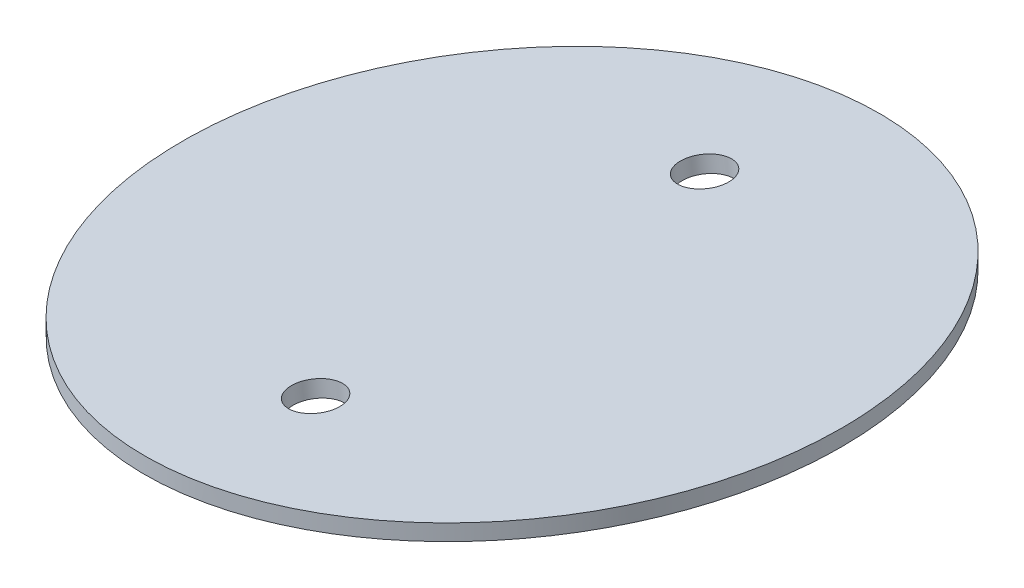
ISO-10303-21;
HEADER;
FILE_DESCRIPTION(('STEP AP214'),'2;1');
FILE_NAME('part.step','',(''),(''),'','','');
FILE_SCHEMA(('AUTOMOTIVE_DESIGN { 1 0 10303 214 1 1 1 1 }'));
ENDSEC;
DATA;
#1=APPLICATION_CONTEXT('core data for automotive mechanical design processes');
#2=APPLICATION_PROTOCOL_DEFINITION('international standard','automotive_design',2000,#1);
#3=PRODUCT_CONTEXT('',#1,'mechanical');
#4=PRODUCT('Part','Part','',(#3));
#5=PRODUCT_RELATED_PRODUCT_CATEGORY('part','',(#4));
#6=PRODUCT_DEFINITION_FORMATION('','',#4);
#7=PRODUCT_DEFINITION_CONTEXT('part definition',#1,'design');
#8=PRODUCT_DEFINITION('design','',#6,#7);
#9=PRODUCT_DEFINITION_SHAPE('','',#8);
#10=(LENGTH_UNIT() NAMED_UNIT(*) SI_UNIT(.MILLI.,.METRE.));
#11=(NAMED_UNIT(*) PLANE_ANGLE_UNIT() SI_UNIT($,.RADIAN.));
#12=(NAMED_UNIT(*) SI_UNIT($,.STERADIAN.) SOLID_ANGLE_UNIT());
#13=UNCERTAINTY_MEASURE_WITH_UNIT(LENGTH_MEASURE(1.E-05),#10,'distance_accuracy_value','');
#14=(GEOMETRIC_REPRESENTATION_CONTEXT(3) GLOBAL_UNCERTAINTY_ASSIGNED_CONTEXT((#13)) GLOBAL_UNIT_ASSIGNED_CONTEXT((#10,
#11,#12)) REPRESENTATION_CONTEXT('',''));
#15=CARTESIAN_POINT('',(0.,0.,0.));
#16=DIRECTION('',(0.,0.,1.));
#17=DIRECTION('',(1.,0.,0.));
#18=AXIS2_PLACEMENT_3D('',#15,#16,#17);
#19=CARTESIAN_POINT('',(30.5,5.24492910753862,61.));
#20=DIRECTION('',(0.121869343405148,-0.992546151641322,0.));
#21=DIRECTION('',(0.992546151641322,0.121869343405148,0.));
#22=AXIS2_PLACEMENT_3D('',#19,#20,#21);
#23=PLANE('',#22);
#24=CARTESIAN_POINT('',(-0.181441421699763,1.477721794707,48.5));
#25=DIRECTION('',(0.121869343405148,-0.992546151641322,0.));
#26=DIRECTION('',(0.992546151641322,0.121869343405148,0.));
#27=AXIS2_PLACEMENT_3D('',#24,#25,#26);
#28=CIRCLE('',#27,2.25);
#29=CARTESIAN_POINT('',(-2.41467026289274,1.20351577204542,48.5));
#30=VERTEX_POINT('',#29);
#31=EDGE_CURVE('E171',#30,#30,#28,.T.);
#32=ORIENTED_EDGE('',*,*,#31,.T.);
#33=EDGE_LOOP('',(#32));
#34=FACE_BOUND('',#33,.T.);
#35=CARTESIAN_POINT('',(-0.181441421699763,1.477721794707,12.5));
#36=DIRECTION('',(0.121869343405148,-0.992546151641322,0.));
#37=DIRECTION('',(0.992546151641322,0.121869343405148,0.));
#38=AXIS2_PLACEMENT_3D('',#35,#36,#37);
#39=CIRCLE('',#38,2.25);
#40=CARTESIAN_POINT('',(-2.41467026289274,1.20351577204542,12.5));
#41=VERTEX_POINT('',#40);
#42=EDGE_CURVE('E166',#41,#41,#39,.T.);
#43=ORIENTED_EDGE('',*,*,#42,.T.);
#44=EDGE_LOOP('',(#43));
#45=FACE_BOUND('',#44,.T.);
#46=CARTESIAN_POINT('',(0.,1.5,30.5));
#47=DIRECTION('',(0.121869343405148,-0.992546151641322,0.));
#48=DIRECTION('',(0.992546151641322,0.121869343405148,0.));
#49=AXIS2_PLACEMENT_3D('',#46,#47,#48);
#50=ELLIPSE('',#49,30.7290496764949,30.5);
#51=CARTESIAN_POINT('',(30.5,5.24492910753862,30.5));
#52=VERTEX_POINT('',#51);
#53=EDGE_CURVE('E13',#52,#52,#50,.T.);
#54=ORIENTED_EDGE('',*,*,#53,.F.);
#55=EDGE_LOOP('',(#54));
#56=FACE_BOUND('',#55,.T.);
#57=ADVANCED_FACE('F154',(#34,#45,#56),#23,.F.);
#58=CARTESIAN_POINT('',(-30.5,-3.74492910753861,61.));
#59=DIRECTION('',(-0.121869343405148,0.992546151641322,0.));
#60=DIRECTION('',(-0.992546151641322,-0.121869343405148,0.));
#61=AXIS2_PLACEMENT_3D('',#58,#59,#60);
#62=PLANE('',#61);
#63=CARTESIAN_POINT('',(0.,0.,48.5));
#64=DIRECTION('',(-0.121869343405148,0.992546151641322,0.));
#65=DIRECTION('',(-0.992546151641322,-0.121869343405148,0.));
#66=AXIS2_PLACEMENT_3D('',#63,#64,#65);
#67=CIRCLE('',#66,2.25);
#68=CARTESIAN_POINT('',(-2.23322884119299,-0.274206022661579,48.5));
#69=VERTEX_POINT('',#68);
#70=EDGE_CURVE('E157',#69,#69,#67,.T.);
#71=ORIENTED_EDGE('',*,*,#70,.T.);
#72=EDGE_LOOP('',(#71));
#73=FACE_BOUND('',#72,.T.);
#74=CARTESIAN_POINT('',(0.,0.,12.5));
#75=DIRECTION('',(-0.121869343405148,0.992546151641322,0.));
#76=DIRECTION('',(-0.992546151641322,-0.121869343405148,0.));
#77=AXIS2_PLACEMENT_3D('',#74,#75,#76);
#78=CIRCLE('',#77,2.25);
#79=CARTESIAN_POINT('',(-2.23322884119299,-0.274206022661579,12.5));
#80=VERTEX_POINT('',#79);
#81=EDGE_CURVE('E169',#80,#80,#78,.T.);
#82=ORIENTED_EDGE('',*,*,#81,.T.);
#83=EDGE_LOOP('',(#82));
#84=FACE_BOUND('',#83,.T.);
#85=CARTESIAN_POINT('',(0.,0.,30.5));
#86=DIRECTION('',(-0.121869343405148,0.992546151641322,0.));
#87=DIRECTION('',(0.992546151641322,0.121869343405148,0.));
#88=AXIS2_PLACEMENT_3D('',#85,#86,#87);
#89=ELLIPSE('',#88,30.7290496764949,30.5);
#90=CARTESIAN_POINT('',(30.5,3.74492910753863,30.5));
#91=VERTEX_POINT('',#90);
#92=EDGE_CURVE('E161',#91,#91,#89,.T.);
#93=ORIENTED_EDGE('',*,*,#92,.F.);
#94=EDGE_LOOP('',(#93));
#95=FACE_BOUND('',#94,.T.);
#96=ADVANCED_FACE('F182',(#73,#84,#95),#62,.F.);
#97=CARTESIAN_POINT('',(0.,-3.74492910753861,30.5));
#98=DIRECTION('',(0.,1.,0.));
#99=DIRECTION('',(0.,0.,1.));
#100=AXIS2_PLACEMENT_3D('',#97,#98,#99);
#101=CYLINDRICAL_SURFACE('',#100,30.5);
#102=ORIENTED_EDGE('',*,*,#53,.T.);
#103=EDGE_LOOP('',(#102));
#104=FACE_BOUND('',#103,.T.);
#105=ORIENTED_EDGE('',*,*,#92,.T.);
#106=EDGE_LOOP('',(#105));
#107=FACE_BOUND('',#106,.T.);
#108=ADVANCED_FACE('F192',(#104,#107),#101,.T.);
#109=CARTESIAN_POINT('',(0.905980348582108,-7.37861781578991,12.5));
#110=DIRECTION('',(-0.121869343405148,0.992546151641322,0.));
#111=DIRECTION('',(-0.992546151641322,-0.121869343405148,0.));
#112=AXIS2_PLACEMENT_3D('',#109,#110,#111);
#113=CYLINDRICAL_SURFACE('',#112,2.25);
#114=CARTESIAN_POINT('',(-2.23322884119299,-0.274206022661579,12.5));
#115=CARTESIAN_POINT('',(-2.23511885600236,-0.258813087300048,12.5));
#116=CARTESIAN_POINT('',(-2.23700887081173,-0.243420151938516,12.5));
#117=CARTESIAN_POINT('',(-2.24078890043048,-0.212634281215454,12.5));
#118=CARTESIAN_POINT('',(-2.24267891523985,-0.197241345853923,12.5));
#119=CARTESIAN_POINT('',(-2.24645894485859,-0.166455475130861,12.5));
#120=CARTESIAN_POINT('',(-2.24834895966796,-0.151062539769329,12.5));
#121=CARTESIAN_POINT('',(-2.25212898928671,-0.120276669046267,12.5));
#122=CARTESIAN_POINT('',(-2.25401900409608,-0.104883733684736,12.5));
#123=CARTESIAN_POINT('',(-2.25779903371483,-0.0740978629616733,12.5));
#124=CARTESIAN_POINT('',(-2.2596890485242,-0.0587049276001419,12.5));
#125=CARTESIAN_POINT('',(-2.26346907814294,-0.0279190568770795,12.5));
#126=CARTESIAN_POINT('',(-2.26535909295232,-0.0125261215155485,12.5));
#127=CARTESIAN_POINT('',(-2.26913912257106,0.0182597492075139,12.5));
#128=CARTESIAN_POINT('',(-2.27102913738043,0.0336526845690453,12.5));
#129=CARTESIAN_POINT('',(-2.27480916699918,0.0644385552921077,12.5));
#130=CARTESIAN_POINT('',(-2.27669918180855,0.0798314906536388,12.5));
#131=CARTESIAN_POINT('',(-2.2804792114273,0.110617361376701,12.5));
#132=CARTESIAN_POINT('',(-2.28236922623667,0.126010296738233,12.5));
#133=CARTESIAN_POINT('',(-2.28614925585541,0.156796167461296,12.5));
#134=CARTESIAN_POINT('',(-2.28803927066479,0.172189102822827,12.5));
#135=CARTESIAN_POINT('',(-2.29181930028353,0.20297497354589,12.5));
#136=CARTESIAN_POINT('',(-2.2937093150929,0.21836790890742,12.5));
#137=CARTESIAN_POINT('',(-2.29748934471165,0.249153779630483,12.5));
#138=CARTESIAN_POINT('',(-2.29937935952102,0.264546714992014,12.5));
#139=CARTESIAN_POINT('',(-2.30315938913977,0.295332585715077,12.5));
#140=CARTESIAN_POINT('',(-2.30504940394914,0.310725521076608,12.5));
#141=CARTESIAN_POINT('',(-2.30882943356788,0.341511391799671,12.5));
#142=CARTESIAN_POINT('',(-2.31071944837725,0.356904327161202,12.5));
#143=CARTESIAN_POINT('',(-2.314499477996,0.387690197884264,12.5));
#144=CARTESIAN_POINT('',(-2.31638949280537,0.403083133245795,12.5));
#145=CARTESIAN_POINT('',(-2.32016952242412,0.433869003968858,12.5));
#146=CARTESIAN_POINT('',(-2.32205953723349,0.449261939330389,12.5));
#147=CARTESIAN_POINT('',(-2.32583956685223,0.480047810053452,12.5));
#148=CARTESIAN_POINT('',(-2.32772958166161,0.495440745414983,12.5));
#149=CARTESIAN_POINT('',(-2.33150961128035,0.526226616138045,12.5));
#150=CARTESIAN_POINT('',(-2.33339962608972,0.541619551499577,12.5));
#151=CARTESIAN_POINT('',(-2.33717965570847,0.572405422222639,12.5));
#152=CARTESIAN_POINT('',(-2.33906967051784,0.587798357584169,12.5));
#153=CARTESIAN_POINT('',(-2.34284970013659,0.618584228307232,12.5));
#154=CARTESIAN_POINT('',(-2.34473971494596,0.633977163668764,12.5));
#155=CARTESIAN_POINT('',(-2.3485197445647,0.664763034391827,12.5));
#156=CARTESIAN_POINT('',(-2.35040975937408,0.680155969753357,12.5));
#157=CARTESIAN_POINT('',(-2.35418978899282,0.71094184047642,12.5));
#158=CARTESIAN_POINT('',(-2.35607980380219,0.726334775837951,12.5));
#159=CARTESIAN_POINT('',(-2.35985983342094,0.757120646561013,12.5));
#160=CARTESIAN_POINT('',(-2.36174984823031,0.772513581922544,12.5));
#161=CARTESIAN_POINT('',(-2.36552987784905,0.803299452645607,12.5));
#162=CARTESIAN_POINT('',(-2.36741989265843,0.818692388007139,12.5));
#163=CARTESIAN_POINT('',(-2.37119992227717,0.849478258730201,12.5));
#164=CARTESIAN_POINT('',(-2.37308993708654,0.864871194091732,12.5));
#165=CARTESIAN_POINT('',(-2.37686996670529,0.895657064814794,12.5));
#166=CARTESIAN_POINT('',(-2.37875998151466,0.911050000176325,12.5));
#167=CARTESIAN_POINT('',(-2.38254001113341,0.941835870899388,12.5));
#168=CARTESIAN_POINT('',(-2.38443002594278,0.95722880626092,12.5));
#169=CARTESIAN_POINT('',(-2.38821005556152,0.988014676983982,12.5));
#170=CARTESIAN_POINT('',(-2.3901000703709,1.00340761234551,12.5));
#171=CARTESIAN_POINT('',(-2.39388009998964,1.03419348306858,12.5));
#172=CARTESIAN_POINT('',(-2.39577011479901,1.04958641843011,12.5));
#173=CARTESIAN_POINT('',(-2.39955014441776,1.08037228915317,12.5));
#174=CARTESIAN_POINT('',(-2.40144015922713,1.0957652245147,12.5));
#175=CARTESIAN_POINT('',(-2.40522018884588,1.12655109523776,12.5));
#176=CARTESIAN_POINT('',(-2.40711020365525,1.14194403059929,12.5));
#177=CARTESIAN_POINT('',(-2.41089023327399,1.17272990132236,12.5));
#178=CARTESIAN_POINT('',(-2.41278024808336,1.18812283668389,12.5));
#179=CARTESIAN_POINT('',(-2.41467026289274,1.20351577204542,12.5));
#180=B_SPLINE_CURVE_WITH_KNOTS('',3,(#114,#115,#116,#117,#118,#119,#120,#121,#122,#123,#124,
#125,#126,#127,#128,#129,#130,#131,#132,#133,#134,#135,#136,#137,#138,#139,#140,#141,#142,#143,
#144,#145,#146,#147,#148,#149,#150,#151,#152,#153,#154,#155,#156,#157,#158,#159,#160,#161,#162,
#163,#164,#165,#166,#167,#168,#169,#170,#171,#172,#173,#174,#175,#176,#177,#178,#179),
.UNSPECIFIED.,.F.,.F.,(4,2,2,2,2,2,2,2,2,2,2,2,2,2,2,2,2,2,2,2,2,2,2,2,2,2,2,2,2,2,2,2,4),(0.,
0.0465256008581874,0.0930512017163739,0.139576802574561,0.186102403432748,0.232628004290935,
0.279153605149122,0.325679206007309,0.372204806865495,0.418730407723684,0.465256008581871,
0.511781609440057,0.558307210298244,0.604832811156431,0.651358412014619,0.697884012872804,
0.744409613730994,0.790935214589179,0.837460815447367,0.883986416305552,0.930512017163741,
0.977037618021927,1.02356321888011,1.0700888197383,1.11661442059649,1.16314002145467,
1.20966562231286,1.25619122317105,1.30271682402924,1.34924242488742,1.39576802574561,
1.4422936266038,1.48881922746198),.UNSPECIFIED.);
#181=EDGE_CURVE('BSEAM187',#80,#41,#180,.T.);
#182=ORIENTED_EDGE('',*,*,#81,.F.);
#183=ORIENTED_EDGE('',*,*,#42,.F.);
#184=ORIENTED_EDGE('',*,*,#181,.T.);
#185=ORIENTED_EDGE('',*,*,#181,.F.);
#186=EDGE_LOOP('',(#182,#184,#183,#185));
#187=FACE_BOUND('',#186,.T.);
#188=ADVANCED_FACE('F187',(#187),#113,.F.);
#189=CARTESIAN_POINT('',(0.905980348582108,-7.37861781578991,48.5));
#190=DIRECTION('',(-0.121869343405148,0.992546151641322,0.));
#191=DIRECTION('',(-0.992546151641322,-0.121869343405148,0.));
#192=AXIS2_PLACEMENT_3D('',#189,#190,#191);
#193=CYLINDRICAL_SURFACE('',#192,2.25);
#194=CARTESIAN_POINT('',(-2.23322884119299,-0.274206022661579,48.5));
#195=CARTESIAN_POINT('',(-2.23511885600236,-0.258813087300048,48.5));
#196=CARTESIAN_POINT('',(-2.23700887081173,-0.243420151938516,48.5));
#197=CARTESIAN_POINT('',(-2.24078890043048,-0.212634281215454,48.5));
#198=CARTESIAN_POINT('',(-2.24267891523985,-0.197241345853923,48.5));
#199=CARTESIAN_POINT('',(-2.24645894485859,-0.166455475130861,48.5));
#200=CARTESIAN_POINT('',(-2.24834895966797,-0.151062539769329,48.5));
#201=CARTESIAN_POINT('',(-2.25212898928671,-0.120276669046267,48.5));
#202=CARTESIAN_POINT('',(-2.25401900409608,-0.104883733684736,48.5));
#203=CARTESIAN_POINT('',(-2.25779903371483,-0.0740978629616733,48.5));
#204=CARTESIAN_POINT('',(-2.2596890485242,-0.0587049276001419,48.5));
#205=CARTESIAN_POINT('',(-2.26346907814295,-0.0279190568770795,48.5));
#206=CARTESIAN_POINT('',(-2.26535909295232,-0.0125261215155485,48.5));
#207=CARTESIAN_POINT('',(-2.26913912257106,0.018259749207514,48.5));
#208=CARTESIAN_POINT('',(-2.27102913738043,0.0336526845690453,48.5));
#209=CARTESIAN_POINT('',(-2.27480916699918,0.0644385552921077,48.5));
#210=CARTESIAN_POINT('',(-2.27669918180855,0.0798314906536388,48.5));
#211=CARTESIAN_POINT('',(-2.2804792114273,0.110617361376701,48.5));
#212=CARTESIAN_POINT('',(-2.28236922623667,0.126010296738233,48.5));
#213=CARTESIAN_POINT('',(-2.28614925585542,0.156796167461296,48.5));
#214=CARTESIAN_POINT('',(-2.28803927066479,0.172189102822827,48.5));
#215=CARTESIAN_POINT('',(-2.29181930028353,0.20297497354589,48.5));
#216=CARTESIAN_POINT('',(-2.2937093150929,0.21836790890742,48.5));
#217=CARTESIAN_POINT('',(-2.29748934471165,0.249153779630483,48.5));
#218=CARTESIAN_POINT('',(-2.29937935952102,0.264546714992014,48.5));
#219=CARTESIAN_POINT('',(-2.30315938913977,0.295332585715077,48.5));
#220=CARTESIAN_POINT('',(-2.30504940394914,0.310725521076608,48.5));
#221=CARTESIAN_POINT('',(-2.30882943356788,0.341511391799671,48.5));
#222=CARTESIAN_POINT('',(-2.31071944837726,0.356904327161202,48.5));
#223=CARTESIAN_POINT('',(-2.314499477996,0.387690197884264,48.5));
#224=CARTESIAN_POINT('',(-2.31638949280537,0.403083133245795,48.5));
#225=CARTESIAN_POINT('',(-2.32016952242412,0.433869003968858,48.5));
#226=CARTESIAN_POINT('',(-2.32205953723349,0.449261939330389,48.5));
#227=CARTESIAN_POINT('',(-2.32583956685224,0.480047810053452,48.5));
#228=CARTESIAN_POINT('',(-2.32772958166161,0.495440745414983,48.5));
#229=CARTESIAN_POINT('',(-2.33150961128035,0.526226616138045,48.5));
#230=CARTESIAN_POINT('',(-2.33339962608972,0.541619551499577,48.5));
#231=CARTESIAN_POINT('',(-2.33717965570847,0.572405422222639,48.5));
#232=CARTESIAN_POINT('',(-2.33906967051784,0.587798357584169,48.5));
#233=CARTESIAN_POINT('',(-2.34284970013659,0.618584228307232,48.5));
#234=CARTESIAN_POINT('',(-2.34473971494596,0.633977163668764,48.5));
#235=CARTESIAN_POINT('',(-2.3485197445647,0.664763034391827,48.5));
#236=CARTESIAN_POINT('',(-2.35040975937408,0.680155969753357,48.5));
#237=CARTESIAN_POINT('',(-2.35418978899282,0.71094184047642,48.5));
#238=CARTESIAN_POINT('',(-2.35607980380219,0.726334775837951,48.5));
#239=CARTESIAN_POINT('',(-2.35985983342094,0.757120646561013,48.5));
#240=CARTESIAN_POINT('',(-2.36174984823031,0.772513581922544,48.5));
#241=CARTESIAN_POINT('',(-2.36552987784906,0.803299452645607,48.5));
#242=CARTESIAN_POINT('',(-2.36741989265843,0.818692388007139,48.5));
#243=CARTESIAN_POINT('',(-2.37119992227717,0.849478258730201,48.5));
#244=CARTESIAN_POINT('',(-2.37308993708655,0.864871194091732,48.5));
#245=CARTESIAN_POINT('',(-2.37686996670529,0.895657064814794,48.5));
#246=CARTESIAN_POINT('',(-2.37875998151466,0.911050000176325,48.5));
#247=CARTESIAN_POINT('',(-2.38254001113341,0.941835870899388,48.5));
#248=CARTESIAN_POINT('',(-2.38443002594278,0.95722880626092,48.5));
#249=CARTESIAN_POINT('',(-2.38821005556153,0.988014676983982,48.5));
#250=CARTESIAN_POINT('',(-2.3901000703709,1.00340761234551,48.5));
#251=CARTESIAN_POINT('',(-2.39388009998964,1.03419348306858,48.5));
#252=CARTESIAN_POINT('',(-2.39577011479901,1.04958641843011,48.5));
#253=CARTESIAN_POINT('',(-2.39955014441776,1.08037228915317,48.5));
#254=CARTESIAN_POINT('',(-2.40144015922713,1.0957652245147,48.5));
#255=CARTESIAN_POINT('',(-2.40522018884588,1.12655109523776,48.5));
#256=CARTESIAN_POINT('',(-2.40711020365525,1.14194403059929,48.5));
#257=CARTESIAN_POINT('',(-2.41089023327399,1.17272990132236,48.5));
#258=CARTESIAN_POINT('',(-2.41278024808337,1.18812283668389,48.5));
#259=CARTESIAN_POINT('',(-2.41467026289274,1.20351577204542,48.5));
#260=B_SPLINE_CURVE_WITH_KNOTS('',3,(#194,#195,#196,#197,#198,#199,#200,#201,#202,#203,#204,
#205,#206,#207,#208,#209,#210,#211,#212,#213,#214,#215,#216,#217,#218,#219,#220,#221,#222,#223,
#224,#225,#226,#227,#228,#229,#230,#231,#232,#233,#234,#235,#236,#237,#238,#239,#240,#241,#242,
#243,#244,#245,#246,#247,#248,#249,#250,#251,#252,#253,#254,#255,#256,#257,#258,#259),
.UNSPECIFIED.,.F.,.F.,(4,2,2,2,2,2,2,2,2,2,2,2,2,2,2,2,2,2,2,2,2,2,2,2,2,2,2,2,2,2,2,2,4),(0.,
0.0465256008581873,0.0930512017163738,0.139576802574561,0.186102403432748,0.232628004290935,
0.279153605149122,0.325679206007309,0.372204806865495,0.418730407723684,0.465256008581871,
0.511781609440057,0.558307210298244,0.604832811156431,0.651358412014619,0.697884012872804,
0.744409613730993,0.790935214589179,0.837460815447366,0.883986416305552,0.930512017163741,
0.977037618021927,1.02356321888011,1.0700888197383,1.11661442059649,1.16314002145467,
1.20966562231286,1.25619122317105,1.30271682402924,1.34924242488742,1.39576802574561,
1.4422936266038,1.48881922746198),.UNSPECIFIED.);
#261=EDGE_CURVE('BSEAM184',#69,#30,#260,.T.);
#262=ORIENTED_EDGE('',*,*,#70,.F.);
#263=ORIENTED_EDGE('',*,*,#31,.F.);
#264=ORIENTED_EDGE('',*,*,#261,.T.);
#265=ORIENTED_EDGE('',*,*,#261,.F.);
#266=EDGE_LOOP('',(#262,#264,#263,#265));
#267=FACE_BOUND('',#266,.T.);
#268=ADVANCED_FACE('F184',(#267),#193,.F.);
#269=CLOSED_SHELL('',(#57,#96,#108,#188,#268));
#270=MANIFOLD_SOLID_BREP('B2',#269);
#271=ADVANCED_BREP_SHAPE_REPRESENTATION('',(#18,#270),#14);
#272=SHAPE_DEFINITION_REPRESENTATION(#9,#271);
ENDSEC;
END-ISO-10303-21;
